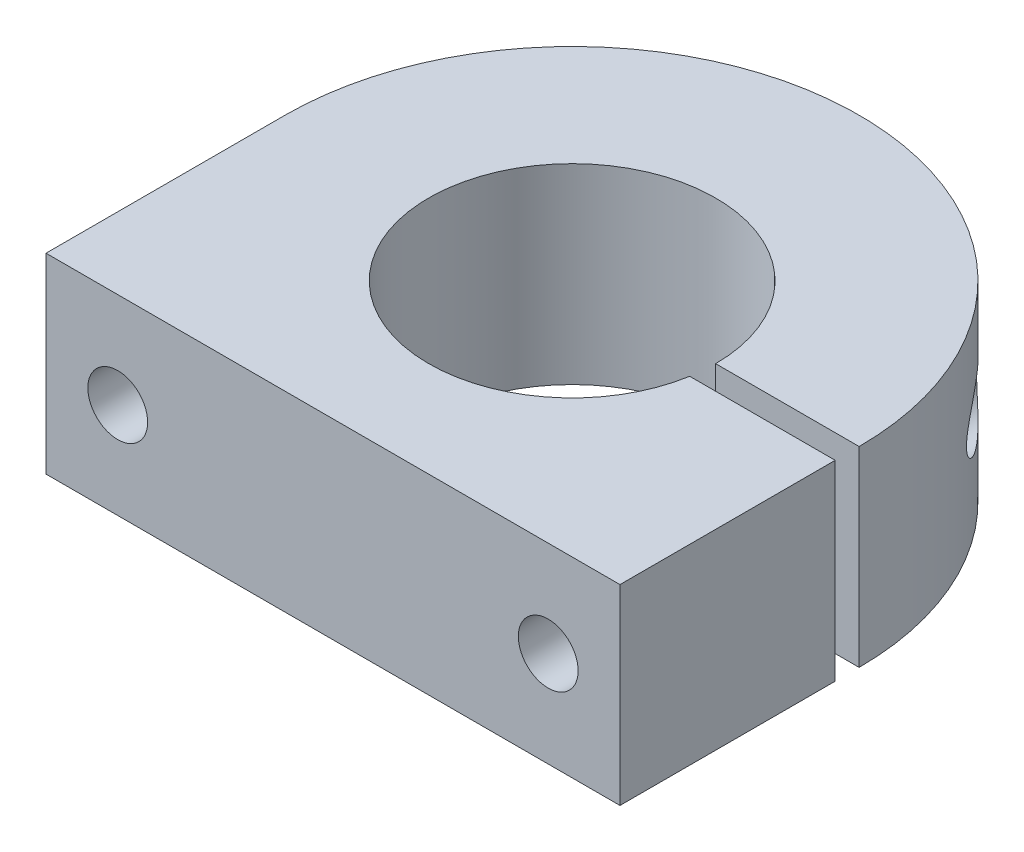
ISO-10303-21;
HEADER;
FILE_DESCRIPTION(('STEP AP214'),'2;1');
FILE_NAME('part.step','',(''),(''),'','','');
FILE_SCHEMA(('AUTOMOTIVE_DESIGN { 1 0 10303 214 1 1 1 1 }'));
ENDSEC;
DATA;
#1=APPLICATION_CONTEXT('core data for automotive mechanical design processes');
#2=APPLICATION_PROTOCOL_DEFINITION('international standard','automotive_design',2000,#1);
#3=PRODUCT_CONTEXT('',#1,'mechanical');
#4=PRODUCT('Part','Part','',(#3));
#5=PRODUCT_RELATED_PRODUCT_CATEGORY('part','',(#4));
#6=PRODUCT_DEFINITION_FORMATION('','',#4);
#7=PRODUCT_DEFINITION_CONTEXT('part definition',#1,'design');
#8=PRODUCT_DEFINITION('design','',#6,#7);
#9=PRODUCT_DEFINITION_SHAPE('','',#8);
#10=(LENGTH_UNIT() NAMED_UNIT(*) SI_UNIT(.MILLI.,.METRE.));
#11=(NAMED_UNIT(*) PLANE_ANGLE_UNIT() SI_UNIT($,.RADIAN.));
#12=(NAMED_UNIT(*) SI_UNIT($,.STERADIAN.) SOLID_ANGLE_UNIT());
#13=UNCERTAINTY_MEASURE_WITH_UNIT(LENGTH_MEASURE(1.E-05),#10,'distance_accuracy_value','');
#14=(GEOMETRIC_REPRESENTATION_CONTEXT(3) GLOBAL_UNCERTAINTY_ASSIGNED_CONTEXT((#13)) GLOBAL_UNIT_ASSIGNED_CONTEXT((#10,
#11,#12)) REPRESENTATION_CONTEXT('',''));
#15=CARTESIAN_POINT('',(0.,0.,0.));
#16=DIRECTION('',(0.,0.,1.));
#17=DIRECTION('',(1.,0.,0.));
#18=AXIS2_PLACEMENT_3D('',#15,#16,#17);
#19=CARTESIAN_POINT('',(9.,4.,10.));
#20=DIRECTION('',(0.,0.,1.));
#21=DIRECTION('',(1.,0.,0.));
#22=AXIS2_PLACEMENT_3D('',#19,#20,#21);
#23=CYLINDRICAL_SURFACE('',#22,1.25);
#24=CARTESIAN_POINT('',(9.,4.,0.));
#25=DIRECTION('',(0.,0.,-1.));
#26=DIRECTION('',(-1.,0.,0.));
#27=AXIS2_PLACEMENT_3D('',#24,#25,#26);
#28=CIRCLE('',#27,1.25);
#29=CARTESIAN_POINT('',(7.75,4.,0.));
#30=VERTEX_POINT('',#29);
#31=EDGE_CURVE('E37',#30,#30,#28,.F.);
#32=ORIENTED_EDGE('',*,*,#31,.T.);
#33=EDGE_LOOP('',(#32));
#34=FACE_BOUND('',#33,.T.);
#35=CARTESIAN_POINT('',(10.25,4.,-6.23999198717436));
#36=CARTESIAN_POINT('',(10.2499992091107,4.03933218564692,-6.23999339521499));
#37=CARTESIAN_POINT('',(10.2481256975103,4.0786699776273,-6.24307388678695));
#38=CARTESIAN_POINT('',(10.2408251894319,4.15611395403662,-6.25504163594665));
#39=CARTESIAN_POINT('',(10.2353944910524,4.19421881197321,-6.2639349428081));
#40=CARTESIAN_POINT('',(10.2197337455818,4.27740740887657,-6.28946052712483));
#41=CARTESIAN_POINT('',(10.2086523342324,4.32190548570971,-6.30745740575483));
#42=CARTESIAN_POINT('',(10.1827498669556,4.40692614760493,-6.34918971241709));
#43=CARTESIAN_POINT('',(10.1679212658835,4.44744047979861,-6.37293671451619));
#44=CARTESIAN_POINT('',(10.1260999095398,4.54656502557882,-6.43928366662833));
#45=CARTESIAN_POINT('',(10.0970048123306,4.60224767352161,-6.48489115615136));
#46=CARTESIAN_POINT('',(10.0339674182631,4.70502329780913,-6.58201196584642));
#47=CARTESIAN_POINT('',(10.0000122542189,4.75209269156227,-6.63354088944813));
#48=CARTESIAN_POINT('',(9.93345455001866,4.83276372098579,-6.73272179289595));
#49=CARTESIAN_POINT('',(9.90131983723402,4.8673279375162,-6.77991734325878));
#50=CARTESIAN_POINT('',(9.83479176441755,4.93153740252713,-6.87606665108929));
#51=CARTESIAN_POINT('',(9.80039685108948,4.96117921774224,-6.9250216069943));
#52=CARTESIAN_POINT('',(9.72964327320866,5.01593413703306,-7.02408348058967));
#53=CARTESIAN_POINT('',(9.69328321662279,5.04104397471185,-7.07419120003312));
#54=CARTESIAN_POINT('',(9.61882921633635,5.08695061229148,-7.17510048008644));
#55=CARTESIAN_POINT('',(9.58073458389182,5.1077456804008,-7.22590231060158));
#56=CARTESIAN_POINT('',(9.45926562623853,5.1661873003438,-7.38517302182282));
#57=CARTESIAN_POINT('',(9.37310933512469,5.19651436543843,-7.49429947734523));
#58=CARTESIAN_POINT('',(9.19522436272297,5.23802806057958,-7.71152123958149));
#59=CARTESIAN_POINT('',(9.10349901326434,5.24922602049329,-7.81961711893232));
#60=CARTESIAN_POINT('',(8.92462659896674,5.25063021803045,-8.02294739169237));
#61=CARTESIAN_POINT('',(8.837817872389,5.24264672913366,-8.1184596250959));
#62=CARTESIAN_POINT('',(8.66302078584222,5.20701406257366,-8.3047144435168));
#63=CARTESIAN_POINT('',(8.57503406011204,5.17938981823644,-8.39546291929287));
#64=CARTESIAN_POINT('',(8.42598385577859,5.11250057666265,-8.5446242951259));
#65=CARTESIAN_POINT('',(8.36434462320892,5.078738441401,-8.60492290618889));
#66=CARTESIAN_POINT('',(8.244323661844,4.99832585596409,-8.71997645631119));
#67=CARTESIAN_POINT('',(8.18593748949707,4.95169353184575,-8.77473904505013));
#68=CARTESIAN_POINT('',(8.08778248568229,4.85669116229621,-8.86516765614301));
#69=CARTESIAN_POINT('',(8.04677689932572,4.81106199490111,-8.90236069350497));
#70=CARTESIAN_POINT('',(7.9703182408391,4.71146496589538,-8.97087805308713));
#71=CARTESIAN_POINT('',(7.93485869907909,4.65750696840364,-9.00220922185858));
#72=CARTESIAN_POINT('',(7.87695426678463,4.55160855139532,-9.05289024781204));
#73=CARTESIAN_POINT('',(7.85332311850264,4.50086115093914,-9.07336948078475));
#74=CARTESIAN_POINT('',(7.81264747059142,4.3948546045067,-9.10841716139915));
#75=CARTESIAN_POINT('',(7.7956000370711,4.33959748152031,-9.12298824202685));
#76=CARTESIAN_POINT('',(7.76913885831279,4.22564885450921,-9.14553395300282));
#77=CARTESIAN_POINT('',(7.75976500960376,4.16694108097142,-9.15347411208996));
#78=CARTESIAN_POINT('',(7.7495147719605,4.04826299960988,-9.16215420513128));
#79=CARTESIAN_POINT('',(7.7486355047331,3.98829312633747,-9.16289657797449));
#80=CARTESIAN_POINT('',(7.75512276009808,3.87457590463987,-9.15740584636966));
#81=CARTESIAN_POINT('',(7.76175542258421,3.82075364229869,-9.15179355816466));
#82=CARTESIAN_POINT('',(7.78167098338806,3.71530004918041,-9.13486539236919));
#83=CARTESIAN_POINT('',(7.79495368329147,3.66366865308522,-9.12354968494914));
#84=CARTESIAN_POINT('',(7.82770747785515,3.5628579646038,-9.09546396064071));
#85=CARTESIAN_POINT('',(7.84728976404311,3.51374266887295,-9.07859580493888));
#86=CARTESIAN_POINT('',(7.89155549193413,3.4198712712591,-9.0401444937298));
#87=CARTESIAN_POINT('',(7.91624145779259,3.37511734257837,-9.01855900484212));
#88=CARTESIAN_POINT('',(7.98015500936385,3.27387082403293,-8.96211848962755));
#89=CARTESIAN_POINT('',(8.02129411277609,3.21963161737587,-8.92537526761341));
#90=CARTESIAN_POINT('',(8.10895882910943,3.12083651944057,-8.84580758841613));
#91=CARTESIAN_POINT('',(8.15549429393862,3.07629878017165,-8.80297197527955));
#92=CARTESIAN_POINT('',(8.26853982381585,2.98287791448614,-8.69707360804958));
#93=CARTESIAN_POINT('',(8.33640804560108,2.93778410227976,-8.63212653910586));
#94=CARTESIAN_POINT('',(8.474682547407,2.86301275317037,-8.49642369975702));
#95=CARTESIAN_POINT('',(8.54509250505581,2.83335859703828,-8.4256593065234));
#96=CARTESIAN_POINT('',(8.71291840813262,2.77912298676238,-8.25254450913869));
#97=CARTESIAN_POINT('',(8.81045915677909,2.76072020005332,-8.14838492276607));
#98=CARTESIAN_POINT('',(9.0024242771837,2.74629214419304,-7.93580558065219));
#99=CARTESIAN_POINT('',(9.09684375919324,2.75030045453665,-7.82737967397657));
#100=CARTESIAN_POINT('',(9.28288953085894,2.77870611383374,-7.60587711784856));
#101=CARTESIAN_POINT('',(9.3743798980955,2.80362948331971,-7.49275277774974));
#102=CARTESIAN_POINT('',(9.50619852412703,2.85610677977418,-7.32375114645888));
#103=CARTESIAN_POINT('',(9.54923488495943,2.87611433941042,-7.2675319151578));
#104=CARTESIAN_POINT('',(9.6333286895814,2.92126372461064,-7.15568737583683));
#105=CARTESIAN_POINT('',(9.67438676513559,2.94640389746353,-7.10006188268409));
#106=CARTESIAN_POINT('',(9.76902662872759,3.01230094460622,-6.96956144337161));
#107=CARTESIAN_POINT('',(9.82164459974774,3.05539816788511,-6.89515079853556));
#108=CARTESIAN_POINT('',(9.9217641169484,3.15280775285044,-6.75028112492229));
#109=CARTESIAN_POINT('',(9.96927244682356,3.20710495838315,-6.6798169178754));
#110=CARTESIAN_POINT('',(10.0419362622984,3.30772089885046,-6.56979747060014));
#111=CARTESIAN_POINT('',(10.0690956547238,3.35018119139294,-6.52805565037473));
#112=CARTESIAN_POINT('',(10.1195520714074,3.44158822670103,-6.44955981056253));
#113=CARTESIAN_POINT('',(10.1428552173099,3.49052446248039,-6.41279790271803));
#114=CARTESIAN_POINT('',(10.1778945091177,3.57973929075358,-6.35698116493613));
#115=CARTESIAN_POINT('',(10.1910033197249,3.61820961101206,-6.33592305741675));
#116=CARTESIAN_POINT('',(10.2138202686918,3.69854553109233,-6.29907493727708));
#117=CARTESIAN_POINT('',(10.2235343763281,3.74040501005717,-6.28327567979632));
#118=CARTESIAN_POINT('',(10.2372500852788,3.81844573824859,-6.26089850906759));
#119=CARTESIAN_POINT('',(10.2419950314495,3.85414922084592,-6.25312513263849));
#120=CARTESIAN_POINT('',(10.2483693502246,3.92656728674743,-6.24267286229436));
#121=CARTESIAN_POINT('',(10.2500007383395,3.96328120033854,-6.23999067268951));
#122=CARTESIAN_POINT('',(10.25,4.,-6.23999198717436));
#123=B_SPLINE_CURVE_WITH_KNOTS('',3,(#35,#36,#37,#38,#39,#40,#41,#42,#43,#44,#45,#46,#47,#48,
#49,#50,#51,#52,#53,#54,#55,#56,#57,#58,#59,#60,#61,#62,#63,#64,#65,#66,#67,#68,#69,#70,#71,#72,
#73,#74,#75,#76,#77,#78,#79,#80,#81,#82,#83,#84,#85,#86,#87,#88,#89,#90,#91,#92,#93,#94,#95,#96,
#97,#98,#99,#100,#101,#102,#103,#104,#105,#106,#107,#108,#109,#110,#111,#112,#113,#114,#115,
#116,#117,#118,#119,#120,#121,#122),.UNSPECIFIED.,.T.,.F.,(4,2,2,2,2,2,2,2,2,2,2,2,2,2,2,2,2,2,
2,2,2,2,2,2,2,2,2,2,2,2,2,2,2,2,2,2,2,2,2,2,2,2,2,4),(0.,0.117850625292618,0.23582409092628,
0.382784043510627,0.530042298207909,0.761650812325413,0.99388426697527,1.19384317725498,
1.39394097392331,1.59418241897822,1.7945040788592,2.21991063854893,2.64506514917331,
3.03169303072109,3.41783097456292,3.69474666309707,3.97127432323147,4.1857156848951,
4.3999049978176,4.57799027111288,4.75599609270551,4.93492162778143,5.11378653382935,
5.27657878632667,5.43936618195107,5.60520094463353,5.7711179221922,6.00191681443585,
6.23314390448968,6.54403355535053,6.855392637127,7.28471793731353,7.71468668598233,
8.15580511677717,8.37636039041029,8.59684475652678,8.89862031424629,9.19999014820063,
9.39588556409009,9.59146695666424,9.72836161504694,9.86501433084967,9.97510578455523,
10.0851259481674),.UNSPECIFIED.);
#124=CARTESIAN_POINT('',(10.25,4.,-6.23999198717436));
#125=VERTEX_POINT('',#124);
#126=EDGE_CURVE('E134',#125,#125,#123,.T.);
#127=ORIENTED_EDGE('',*,*,#126,.F.);
#128=EDGE_LOOP('',(#127));
#129=FACE_BOUND('',#128,.T.);
#130=ADVANCED_FACE('F33',(#34,#129),#23,.F.);
#131=CARTESIAN_POINT('',(-12.,8.,10.));
#132=DIRECTION('',(0.,0.,-1.));
#133=DIRECTION('',(-1.,0.,0.));
#134=AXIS2_PLACEMENT_3D('',#131,#132,#133);
#135=PLANE('',#134);
#136=CARTESIAN_POINT('',(-9.,4.,10.));
#137=DIRECTION('',(0.,0.,1.));
#138=DIRECTION('',(1.,0.,0.));
#139=AXIS2_PLACEMENT_3D('',#136,#137,#138);
#140=CIRCLE('',#139,1.25);
#141=CARTESIAN_POINT('',(-7.75,4.,10.));
#142=VERTEX_POINT('',#141);
#143=EDGE_CURVE('E204',#142,#142,#140,.T.);
#144=ORIENTED_EDGE('',*,*,#143,.F.);
#145=EDGE_LOOP('',(#144));
#146=FACE_BOUND('',#145,.T.);
#147=CARTESIAN_POINT('',(9.,4.,10.));
#148=DIRECTION('',(0.,0.,1.));
#149=DIRECTION('',(1.,0.,0.));
#150=AXIS2_PLACEMENT_3D('',#147,#148,#149);
#151=CIRCLE('',#150,1.25);
#152=CARTESIAN_POINT('',(10.25,4.,10.));
#153=VERTEX_POINT('',#152);
#154=EDGE_CURVE('E142',#153,#153,#151,.T.);
#155=ORIENTED_EDGE('',*,*,#154,.F.);
#156=EDGE_LOOP('',(#155));
#157=FACE_BOUND('',#156,.T.);
#158=DIRECTION('',(1.,0.,0.));
#159=VECTOR('',#158,1.);
#160=CARTESIAN_POINT('',(-12.,0.,10.));
#161=LINE('',#160,#159);
#162=CARTESIAN_POINT('',(-12.,0.,10.));
#163=VERTEX_POINT('',#162);
#164=CARTESIAN_POINT('',(12.,0.,10.));
#165=VERTEX_POINT('',#164);
#166=EDGE_CURVE('E116',#163,#165,#161,.T.);
#167=ORIENTED_EDGE('',*,*,#166,.T.);
#168=DIRECTION('',(0.,-1.,0.));
#169=VECTOR('',#168,1.);
#170=CARTESIAN_POINT('',(12.,8.,10.));
#171=LINE('',#170,#169);
#172=CARTESIAN_POINT('',(12.,8.,10.));
#173=VERTEX_POINT('',#172);
#174=EDGE_CURVE('E11',#173,#165,#171,.T.);
#175=ORIENTED_EDGE('',*,*,#174,.F.);
#176=DIRECTION('',(1.,0.,0.));
#177=VECTOR('',#176,1.);
#178=CARTESIAN_POINT('',(-12.,8.,10.));
#179=LINE('',#178,#177);
#180=CARTESIAN_POINT('',(-12.,8.,10.));
#181=VERTEX_POINT('',#180);
#182=EDGE_CURVE('E126',#181,#173,#179,.T.);
#183=ORIENTED_EDGE('',*,*,#182,.F.);
#184=DIRECTION('',(0.,-1.,0.));
#185=VECTOR('',#184,1.);
#186=CARTESIAN_POINT('',(-12.,8.,10.));
#187=LINE('',#186,#185);
#188=EDGE_CURVE('E127',#181,#163,#187,.T.);
#189=ORIENTED_EDGE('',*,*,#188,.T.);
#190=EDGE_LOOP('',(#167,#175,#183,#189));
#191=FACE_BOUND('',#190,.T.);
#192=ADVANCED_FACE('F35',(#146,#157,#191),#135,.F.);
#193=CARTESIAN_POINT('',(12.,8.,10.));
#194=DIRECTION('',(-1.,0.,0.));
#195=DIRECTION('',(0.,0.,1.));
#196=AXIS2_PLACEMENT_3D('',#193,#194,#195);
#197=PLANE('',#196);
#198=DIRECTION('',(0.,0.,-1.));
#199=VECTOR('',#198,1.);
#200=CARTESIAN_POINT('',(12.,0.,10.));
#201=LINE('',#200,#199);
#202=CARTESIAN_POINT('',(12.,0.,1.));
#203=VERTEX_POINT('',#202);
#204=EDGE_CURVE('E107',#165,#203,#201,.T.);
#205=ORIENTED_EDGE('',*,*,#204,.T.);
#206=DIRECTION('',(0.,1.,0.));
#207=VECTOR('',#206,1.);
#208=CARTESIAN_POINT('',(12.,0.,1.));
#209=LINE('',#208,#207);
#210=CARTESIAN_POINT('',(12.,8.,1.));
#211=VERTEX_POINT('',#210);
#212=EDGE_CURVE('E92',#203,#211,#209,.T.);
#213=ORIENTED_EDGE('',*,*,#212,.T.);
#214=DIRECTION('',(0.,0.,-1.));
#215=VECTOR('',#214,1.);
#216=CARTESIAN_POINT('',(12.,8.,10.));
#217=LINE('',#216,#215);
#218=EDGE_CURVE('E194',#173,#211,#217,.T.);
#219=ORIENTED_EDGE('',*,*,#218,.F.);
#220=ORIENTED_EDGE('',*,*,#174,.T.);
#221=EDGE_LOOP('',(#205,#213,#219,#220));
#222=FACE_BOUND('',#221,.T.);
#223=ADVANCED_FACE('F112',(#222),#197,.F.);
#224=CARTESIAN_POINT('',(0.,8.,0.));
#225=DIRECTION('',(0.,-1.,0.));
#226=DIRECTION('',(0.,0.,-1.));
#227=AXIS2_PLACEMENT_3D('',#224,#225,#226);
#228=CYLINDRICAL_SURFACE('',#227,12.);
#229=CARTESIAN_POINT('',(-7.75,4.,-9.16174110090434));
#230=CARTESIAN_POINT('',(-7.75000329382592,4.05778473112429,-9.16173876549198));
#231=CARTESIAN_POINT('',(-7.75403563287774,4.1155984419246,-9.15833198913326));
#232=CARTESIAN_POINT('',(-7.76987941057312,4.22937010675851,-9.14489345652991));
#233=CARTESIAN_POINT('',(-7.78169710897,4.28532652939525,-9.13485636922133));
#234=CARTESIAN_POINT('',(-7.81223402748615,4.39352005252047,-9.10875379352554));
#235=CARTESIAN_POINT('',(-7.83092123167141,4.44577308647906,-9.09271626464512));
#236=CARTESIAN_POINT('',(-7.87410967516978,4.54574941217809,-9.05534159878707));
#237=CARTESIAN_POINT('',(-7.89861285941566,4.5934711811194,-9.03400268885301));
#238=CARTESIAN_POINT('',(-7.96047849073112,4.69756160020599,-8.97958476934404));
#239=CARTESIAN_POINT('',(-7.99948282342944,4.75212060468661,-8.944910559834));
#240=CARTESIAN_POINT('',(-8.08302505571842,4.85200657825673,-8.86949205067561));
#241=CARTESIAN_POINT('',(-8.12757177361073,4.89731852432052,-8.82873805664431));
#242=CARTESIAN_POINT('',(-8.23585290691729,4.99266931529078,-8.72799185078213));
#243=CARTESIAN_POINT('',(-8.30099106462598,5.03914703416816,-8.66614732173492));
#244=CARTESIAN_POINT('',(-8.43417605666856,5.11728470389946,-8.53659029829508));
#245=CARTESIAN_POINT('',(-8.50222739081257,5.14892075704498,-8.46886854684973));
#246=CARTESIAN_POINT('',(-8.66509516964625,5.20849837201718,-8.30266631685975));
#247=CARTESIAN_POINT('',(-8.7602039839631,5.23041043397569,-8.20231954732441));
#248=CARTESIAN_POINT('',(-8.94793896561733,5.25249502348998,-7.99711481164475));
#249=CARTESIAN_POINT('',(-9.04056178965265,5.25263961109683,-7.89225122046186));
#250=CARTESIAN_POINT('',(-9.22367638918277,5.23335801701891,-7.67751492133652));
#251=CARTESIAN_POINT('',(-9.31404103585146,5.21339766258356,-7.56758361036431));
#252=CARTESIAN_POINT('',(-9.48837538010052,5.15432864974886,-7.34781571127048));
#253=CARTESIAN_POINT('',(-9.57234617045278,5.11522327194559,-7.23797911014892));
#254=CARTESIAN_POINT('',(-9.71505402591321,5.02790874185081,-7.04477448939541));
#255=CARTESIAN_POINT('',(-9.77531551119639,4.98351001321018,-6.96082958019718));
#256=CARTESIAN_POINT('',(-9.86115857172025,4.90684529104308,-6.83813243921778));
#257=CARTESIAN_POINT('',(-9.88900264752804,4.87962784551704,-6.79778839851953));
#258=CARTESIAN_POINT('',(-9.9429559017259,4.82152701922355,-6.71862459115928));
#259=CARTESIAN_POINT('',(-9.96906597142236,4.79064554493184,-6.67980404566105));
#260=CARTESIAN_POINT('',(-10.023431340538,4.71932246079312,-6.59800101346813));
#261=CARTESIAN_POINT('',(-10.0513174208575,4.67814548048193,-6.55540519649729));
#262=CARTESIAN_POINT('',(-10.1034717987469,4.58948357630525,-6.47473185336537));
#263=CARTESIAN_POINT('',(-10.1277442324541,4.5420059836737,-6.43664917187172));
#264=CARTESIAN_POINT('',(-10.1655570068972,4.4534763374743,-6.37670461184714));
#265=CARTESIAN_POINT('',(-10.1802394741799,4.41403204740618,-6.35321363379986));
#266=CARTESIAN_POINT('',(-10.2060702630151,4.33130402974848,-6.31163438338286));
#267=CARTESIAN_POINT('',(-10.2172248635015,4.28802730097219,-6.29353651565562));
#268=CARTESIAN_POINT('',(-10.2332321107966,4.20729728870408,-6.26746741958677));
#269=CARTESIAN_POINT('',(-10.2389027776749,4.17043468835701,-6.25818879680928));
#270=CARTESIAN_POINT('',(-10.2469228157643,4.09540572891,-6.2450487754894));
#271=CARTESIAN_POINT('',(-10.2492753323405,4.05724063967912,-6.24118224670218));
#272=CARTESIAN_POINT('',(-10.2504380126251,3.98061696251101,-6.23927258382777));
#273=CARTESIAN_POINT('',(-10.249239943124,3.94215789900158,-6.24124298458999));
#274=CARTESIAN_POINT('',(-10.2434049351547,3.86621350891236,-6.25081473020462));
#275=CARTESIAN_POINT('',(-10.2387652992967,3.82872896999907,-6.2584204918677));
#276=CARTESIAN_POINT('',(-10.2250302304111,3.74726173409174,-6.28084099149056));
#277=CARTESIAN_POINT('',(-10.2151569551455,3.70376022520971,-6.29690896491985));
#278=CARTESIAN_POINT('',(-10.1917505932705,3.62037285776083,-6.33472292931634));
#279=CARTESIAN_POINT('',(-10.178210271717,3.58049435721009,-6.35648014198109));
#280=CARTESIAN_POINT('',(-10.1401358232124,3.4836771757485,-6.41712676797016));
#281=CARTESIAN_POINT('',(-10.11363810617,3.42932908334086,-6.45887992466358));
#282=CARTESIAN_POINT('',(-10.0559782567798,3.32859004861707,-6.54829409112651));
#283=CARTESIAN_POINT('',(-10.0248043694298,3.28221981051328,-6.59596993596973));
#284=CARTESIAN_POINT('',(-9.9634556196606,3.2022345979263,-6.68821333549465));
#285=CARTESIAN_POINT('',(-9.93371934298879,3.16774261613096,-6.73232462413741));
#286=CARTESIAN_POINT('',(-9.87208150343062,3.10336082601157,-6.8223886829527));
#287=CARTESIAN_POINT('',(-9.84017846256389,3.07347420542886,-6.86834270114535));
#288=CARTESIAN_POINT('',(-9.77447326641814,3.01788759017879,-6.96153211983636));
#289=CARTESIAN_POINT('',(-9.74066810773971,2.99219448147364,-7.00876948223137));
#290=CARTESIAN_POINT('',(-9.67140982848012,2.9447893037471,-7.10403428597371));
#291=CARTESIAN_POINT('',(-9.63595630642223,2.92307821102349,-7.15206191793988));
#292=CARTESIAN_POINT('',(-9.55188528645769,2.87710129486039,-7.26414808496431));
#293=CARTESIAN_POINT('',(-9.50271023913063,2.85427018499905,-7.32838072706294));
#294=CARTESIAN_POINT('',(-9.40205961174606,2.81519521598938,-7.4570741827501));
#295=CARTESIAN_POINT('',(-9.35058317469958,2.79895383378481,-7.52153507296598));
#296=CARTESIAN_POINT('',(-9.24568084083397,2.77319336430751,-7.65011495859748));
#297=CARTESIAN_POINT('',(-9.19225696326875,2.76366751128958,-7.71423423334223));
#298=CARTESIAN_POINT('',(-9.08374739423485,2.75161488001754,-7.84171847697069));
#299=CARTESIAN_POINT('',(-9.02866160856917,2.74908849924999,-7.90508340281293));
#300=CARTESIAN_POINT('',(-8.88929378052026,2.75210096129234,-8.06202690341144));
#301=CARTESIAN_POINT('',(-8.80419803686098,2.76230931655321,-8.15485445135288));
#302=CARTESIAN_POINT('',(-8.63326179730599,2.80180303863258,-8.33559717312521));
#303=CARTESIAN_POINT('',(-8.54742291438101,2.83105409366133,-8.42352087411838));
#304=CARTESIAN_POINT('',(-8.40185174590038,2.90032265840032,-8.56833438499586));
#305=CARTESIAN_POINT('',(-8.34147822483897,2.93510847845011,-8.62707102070286));
#306=CARTESIAN_POINT('',(-8.22417246843249,3.01729729918341,-8.7389652918354));
#307=CARTESIAN_POINT('',(-8.16723592525437,3.06468408552446,-8.79212997529089));
#308=CARTESIAN_POINT('',(-8.07171377270778,3.16077650769354,-8.87979022705126));
#309=CARTESIAN_POINT('',(-8.03186685745707,3.20683296184362,-8.91580550004241));
#310=CARTESIAN_POINT('',(-7.95780663216793,3.30703536594634,-8.98196926967678));
#311=CARTESIAN_POINT('',(-7.92358760681559,3.36117300122981,-9.01212372391039));
#312=CARTESIAN_POINT('',(-7.86782622643503,3.46739195611532,-9.06081984327181));
#313=CARTESIAN_POINT('',(-7.84512595256159,3.5183618962682,-9.08045414400733));
#314=CARTESIAN_POINT('',(-7.80637498031209,3.62457791710696,-9.11378996178785));
#315=CARTESIAN_POINT('',(-7.79031541254952,3.67981817643315,-9.12749939325416));
#316=CARTESIAN_POINT('',(-7.76885915120863,3.77928551156176,-9.14576258065989));
#317=CARTESIAN_POINT('',(-7.76181578579574,3.8229050586028,-9.15173503545013));
#318=CARTESIAN_POINT('',(-7.75238471839955,3.91101061892157,-9.15972538465617));
#319=CARTESIAN_POINT('',(-7.74999746323863,3.95549671494375,-9.1617428995373));
#320=CARTESIAN_POINT('',(-7.75,4.,-9.16174110090434));
#321=B_SPLINE_CURVE_WITH_KNOTS('',3,(#229,#230,#231,#232,#233,#234,#235,#236,#237,#238,#239,
#240,#241,#242,#243,#244,#245,#246,#247,#248,#249,#250,#251,#252,#253,#254,#255,#256,#257,#258,
#259,#260,#261,#262,#263,#264,#265,#266,#267,#268,#269,#270,#271,#272,#273,#274,#275,#276,#277,
#278,#279,#280,#281,#282,#283,#284,#285,#286,#287,#288,#289,#290,#291,#292,#293,#294,#295,#296,
#297,#298,#299,#300,#301,#302,#303,#304,#305,#306,#307,#308,#309,#310,#311,#312,#313,#314,#315,
#316,#317,#318,#319,#320),.UNSPECIFIED.,.T.,.F.,(4,2,2,2,2,2,2,2,2,2,2,2,2,2,2,2,2,2,2,2,2,2,2,
2,2,2,2,2,2,2,2,2,2,2,2,2,2,2,2,2,2,2,2,2,2,4),(0.,0.173171490616386,0.346482388542388,
0.518995589786814,0.69156656297622,0.916835945797436,1.14246844396386,1.44420949449187,
1.74643474793723,2.16412897105138,2.58235932691594,3.01200273581125,3.44157254890118,
3.77803330474403,3.94610493612076,4.11408949646566,4.31010929981715,4.50590298720733,
4.65005855868255,4.79395609759908,4.90877207975646,5.02347915140224,5.1384524173388,
5.25351589099164,5.39496702710966,5.53669930009935,5.7559084221917,5.97567812691128,
6.16562207290603,6.35569690946909,6.54608078517459,6.73651127636554,6.98836433083342,
7.24031196420481,7.49200540182319,7.74371313233515,8.1214007966708,8.49840980695715,
8.77091775949159,9.04307674403818,9.25456148024089,9.46583010232181,9.64255135965613,
9.81903581812403,9.95239216670429,10.0857613121614),.UNSPECIFIED.);
#322=CARTESIAN_POINT('',(-7.75,4.,-9.16174110090434));
#323=VERTEX_POINT('',#322);
#324=EDGE_CURVE('E143',#323,#323,#321,.T.);
#325=ORIENTED_EDGE('',*,*,#324,.T.);
#326=EDGE_LOOP('',(#325));
#327=FACE_BOUND('',#326,.T.);
#328=ORIENTED_EDGE('',*,*,#126,.T.);
#329=EDGE_LOOP('',(#328));
#330=FACE_BOUND('',#329,.T.);
#331=CARTESIAN_POINT('',(0.,0.,0.));
#332=DIRECTION('',(0.,1.,0.));
#333=DIRECTION('',(0.,0.,1.));
#334=AXIS2_PLACEMENT_3D('',#331,#332,#333);
#335=CIRCLE('',#334,12.);
#336=CARTESIAN_POINT('',(12.,0.,0.));
#337=VERTEX_POINT('',#336);
#338=CARTESIAN_POINT('',(-12.,0.,0.));
#339=VERTEX_POINT('',#338);
#340=EDGE_CURVE('E115',#337,#339,#335,.T.);
#341=ORIENTED_EDGE('',*,*,#340,.T.);
#342=DIRECTION('',(0.,-1.,0.));
#343=VECTOR('',#342,1.);
#344=CARTESIAN_POINT('',(-12.,8.,0.));
#345=LINE('',#344,#343);
#346=CARTESIAN_POINT('',(-12.,8.,0.));
#347=VERTEX_POINT('',#346);
#348=EDGE_CURVE('E129',#347,#339,#345,.T.);
#349=ORIENTED_EDGE('',*,*,#348,.F.);
#350=CARTESIAN_POINT('',(0.,8.,0.));
#351=DIRECTION('',(0.,1.,0.));
#352=DIRECTION('',(0.,0.,1.));
#353=AXIS2_PLACEMENT_3D('',#350,#351,#352);
#354=CIRCLE('',#353,12.);
#355=CARTESIAN_POINT('',(12.,8.,0.));
#356=VERTEX_POINT('',#355);
#357=EDGE_CURVE('E193',#356,#347,#354,.T.);
#358=ORIENTED_EDGE('',*,*,#357,.F.);
#359=DIRECTION('',(0.,-1.,0.));
#360=VECTOR('',#359,1.);
#361=CARTESIAN_POINT('',(12.,8.,0.));
#362=LINE('',#361,#360);
#363=EDGE_CURVE('E42',#356,#337,#362,.T.);
#364=ORIENTED_EDGE('',*,*,#363,.T.);
#365=EDGE_LOOP('',(#341,#349,#358,#364));
#366=FACE_BOUND('',#365,.T.);
#367=ADVANCED_FACE('F147',(#327,#330,#366),#228,.T.);
#368=CARTESIAN_POINT('',(-12.,8.,10.));
#369=DIRECTION('',(-1.,0.,0.));
#370=DIRECTION('',(0.,0.,1.));
#371=AXIS2_PLACEMENT_3D('',#368,#369,#370);
#372=PLANE('',#371);
#373=DIRECTION('',(0.,0.,-1.));
#374=VECTOR('',#373,1.);
#375=CARTESIAN_POINT('',(-12.,0.,10.));
#376=LINE('',#375,#374);
#377=EDGE_CURVE('E119',#163,#339,#376,.T.);
#378=ORIENTED_EDGE('',*,*,#377,.F.);
#379=ORIENTED_EDGE('',*,*,#188,.F.);
#380=DIRECTION('',(0.,0.,-1.));
#381=VECTOR('',#380,1.);
#382=CARTESIAN_POINT('',(-12.,8.,10.));
#383=LINE('',#382,#381);
#384=EDGE_CURVE('E130',#181,#347,#383,.T.);
#385=ORIENTED_EDGE('',*,*,#384,.T.);
#386=ORIENTED_EDGE('',*,*,#348,.T.);
#387=EDGE_LOOP('',(#378,#379,#385,#386));
#388=FACE_BOUND('',#387,.T.);
#389=ADVANCED_FACE('F165',(#388),#372,.T.);
#390=CARTESIAN_POINT('',(0.,8.,0.));
#391=DIRECTION('',(0.,1.,0.));
#392=DIRECTION('',(0.,0.,1.));
#393=AXIS2_PLACEMENT_3D('',#390,#391,#392);
#394=PLANE('',#393);
#395=DIRECTION('',(-1.,0.,0.));
#396=VECTOR('',#395,1.);
#397=CARTESIAN_POINT('',(0.,8.,0.));
#398=LINE('',#397,#396);
#399=CARTESIAN_POINT('',(6.,8.,0.));
#400=VERTEX_POINT('',#399);
#401=EDGE_CURVE('E50',#356,#400,#398,.T.);
#402=ORIENTED_EDGE('',*,*,#401,.F.);
#403=ORIENTED_EDGE('',*,*,#357,.T.);
#404=ORIENTED_EDGE('',*,*,#384,.F.);
#405=ORIENTED_EDGE('',*,*,#182,.T.);
#406=ORIENTED_EDGE('',*,*,#218,.T.);
#407=DIRECTION('',(1.,0.,0.));
#408=VECTOR('',#407,1.);
#409=CARTESIAN_POINT('',(0.,8.,1.));
#410=LINE('',#409,#408);
#411=CARTESIAN_POINT('',(5.91607978309962,8.,1.));
#412=VERTEX_POINT('',#411);
#413=EDGE_CURVE('E95',#412,#211,#410,.T.);
#414=ORIENTED_EDGE('',*,*,#413,.F.);
#415=CARTESIAN_POINT('',(0.,8.,0.));
#416=DIRECTION('',(0.,1.,0.));
#417=DIRECTION('',(0.,0.,1.));
#418=AXIS2_PLACEMENT_3D('',#415,#416,#417);
#419=CIRCLE('',#418,6.);
#420=EDGE_CURVE('E141',#400,#412,#419,.T.);
#421=ORIENTED_EDGE('',*,*,#420,.F.);
#422=EDGE_LOOP('',(#402,#403,#404,#405,#406,#414,#421));
#423=FACE_BOUND('',#422,.T.);
#424=ADVANCED_FACE('F162',(#423),#394,.T.);
#425=CARTESIAN_POINT('',(0.,0.,0.));
#426=DIRECTION('',(0.,1.,0.));
#427=DIRECTION('',(0.,0.,1.));
#428=AXIS2_PLACEMENT_3D('',#425,#426,#427);
#429=PLANE('',#428);
#430=ORIENTED_EDGE('',*,*,#340,.F.);
#431=DIRECTION('',(-1.,0.,0.));
#432=VECTOR('',#431,1.);
#433=CARTESIAN_POINT('',(0.,0.,0.));
#434=LINE('',#433,#432);
#435=CARTESIAN_POINT('',(6.,0.,0.));
#436=VERTEX_POINT('',#435);
#437=EDGE_CURVE('E100',#337,#436,#434,.T.);
#438=ORIENTED_EDGE('',*,*,#437,.T.);
#439=CARTESIAN_POINT('',(0.,0.,0.));
#440=DIRECTION('',(0.,1.,0.));
#441=DIRECTION('',(0.,0.,1.));
#442=AXIS2_PLACEMENT_3D('',#439,#440,#441);
#443=CIRCLE('',#442,6.);
#444=CARTESIAN_POINT('',(5.91607978309962,0.,1.));
#445=VERTEX_POINT('',#444);
#446=EDGE_CURVE('E110',#436,#445,#443,.T.);
#447=ORIENTED_EDGE('',*,*,#446,.T.);
#448=DIRECTION('',(1.,0.,0.));
#449=VECTOR('',#448,1.);
#450=CARTESIAN_POINT('',(0.,0.,1.));
#451=LINE('',#450,#449);
#452=EDGE_CURVE('E58',#445,#203,#451,.T.);
#453=ORIENTED_EDGE('',*,*,#452,.T.);
#454=ORIENTED_EDGE('',*,*,#204,.F.);
#455=ORIENTED_EDGE('',*,*,#166,.F.);
#456=ORIENTED_EDGE('',*,*,#377,.T.);
#457=EDGE_LOOP('',(#430,#438,#447,#453,#454,#455,#456));
#458=FACE_BOUND('',#457,.T.);
#459=ADVANCED_FACE('F105',(#458),#429,.F.);
#460=CARTESIAN_POINT('',(0.,0.,0.));
#461=DIRECTION('',(0.,1.,0.));
#462=DIRECTION('',(0.,0.,1.));
#463=AXIS2_PLACEMENT_3D('',#460,#461,#462);
#464=CYLINDRICAL_SURFACE('',#463,6.);
#465=ORIENTED_EDGE('',*,*,#446,.F.);
#466=DIRECTION('',(0.,1.,0.));
#467=VECTOR('',#466,1.);
#468=CARTESIAN_POINT('',(6.,0.,0.));
#469=LINE('',#468,#467);
#470=EDGE_CURVE('E207',#436,#400,#469,.T.);
#471=ORIENTED_EDGE('',*,*,#470,.T.);
#472=ORIENTED_EDGE('',*,*,#420,.T.);
#473=DIRECTION('',(0.,1.,0.));
#474=VECTOR('',#473,1.);
#475=CARTESIAN_POINT('',(5.91607978309962,0.,1.));
#476=LINE('',#475,#474);
#477=EDGE_CURVE('E209',#412,#445,#476,.F.);
#478=ORIENTED_EDGE('',*,*,#477,.T.);
#479=EDGE_LOOP('',(#465,#471,#472,#478));
#480=FACE_BOUND('',#479,.T.);
#481=ADVANCED_FACE('F155',(#480),#464,.F.);
#482=CARTESIAN_POINT('',(9.,4.,0.999999999999999));
#483=DIRECTION('',(0.,0.,1.));
#484=DIRECTION('',(1.,0.,0.));
#485=AXIS2_PLACEMENT_3D('',#482,#483,#484);
#486=CIRCLE('',#485,1.25);
#487=CARTESIAN_POINT('',(10.25,4.,0.999999999999999));
#488=VERTEX_POINT('',#487);
#489=EDGE_CURVE('E99',#488,#488,#486,.F.);
#490=ORIENTED_EDGE('',*,*,#489,.T.);
#491=EDGE_LOOP('',(#490));
#492=FACE_BOUND('',#491,.T.);
#493=ORIENTED_EDGE('',*,*,#154,.T.);
#494=EDGE_LOOP('',(#493));
#495=FACE_BOUND('',#494,.T.);
#496=ADVANCED_FACE('F150',(#492,#495),#23,.F.);
#497=CARTESIAN_POINT('',(-9.,4.,10.));
#498=DIRECTION('',(0.,0.,1.));
#499=DIRECTION('',(1.,0.,0.));
#500=AXIS2_PLACEMENT_3D('',#497,#498,#499);
#501=CYLINDRICAL_SURFACE('',#500,1.25);
#502=ORIENTED_EDGE('',*,*,#143,.T.);
#503=EDGE_LOOP('',(#502));
#504=FACE_BOUND('',#503,.T.);
#505=ORIENTED_EDGE('',*,*,#324,.F.);
#506=EDGE_LOOP('',(#505));
#507=FACE_BOUND('',#506,.T.);
#508=ADVANCED_FACE('F154',(#504,#507),#501,.F.);
#509=CARTESIAN_POINT('',(0.,0.,1.));
#510=DIRECTION('',(0.,0.,1.));
#511=DIRECTION('',(1.,0.,0.));
#512=AXIS2_PLACEMENT_3D('',#509,#510,#511);
#513=PLANE('',#512);
#514=ORIENTED_EDGE('',*,*,#489,.F.);
#515=EDGE_LOOP('',(#514));
#516=FACE_BOUND('',#515,.T.);
#517=ORIENTED_EDGE('',*,*,#413,.T.);
#518=ORIENTED_EDGE('',*,*,#212,.F.);
#519=ORIENTED_EDGE('',*,*,#452,.F.);
#520=ORIENTED_EDGE('',*,*,#477,.F.);
#521=EDGE_LOOP('',(#517,#518,#519,#520));
#522=FACE_BOUND('',#521,.T.);
#523=ADVANCED_FACE('F93',(#516,#522),#513,.F.);
#524=CARTESIAN_POINT('',(0.,0.,0.));
#525=DIRECTION('',(0.,0.,-1.));
#526=DIRECTION('',(-1.,0.,0.));
#527=AXIS2_PLACEMENT_3D('',#524,#525,#526);
#528=PLANE('',#527);
#529=ORIENTED_EDGE('',*,*,#31,.F.);
#530=EDGE_LOOP('',(#529));
#531=FACE_BOUND('',#530,.T.);
#532=ORIENTED_EDGE('',*,*,#437,.F.);
#533=ORIENTED_EDGE('',*,*,#363,.F.);
#534=ORIENTED_EDGE('',*,*,#401,.T.);
#535=ORIENTED_EDGE('',*,*,#470,.F.);
#536=EDGE_LOOP('',(#532,#533,#534,#535));
#537=FACE_BOUND('',#536,.T.);
#538=ADVANCED_FACE('F215',(#531,#537),#528,.F.);
#539=CLOSED_SHELL('',(#130,#192,#223,#367,#389,#424,#459,#481,#496,#508,#523,#538));
#540=MANIFOLD_SOLID_BREP('B2',#539);
#541=ADVANCED_BREP_SHAPE_REPRESENTATION('',(#18,#540),#14);
#542=SHAPE_DEFINITION_REPRESENTATION(#9,#541);
ENDSEC;
END-ISO-10303-21;
